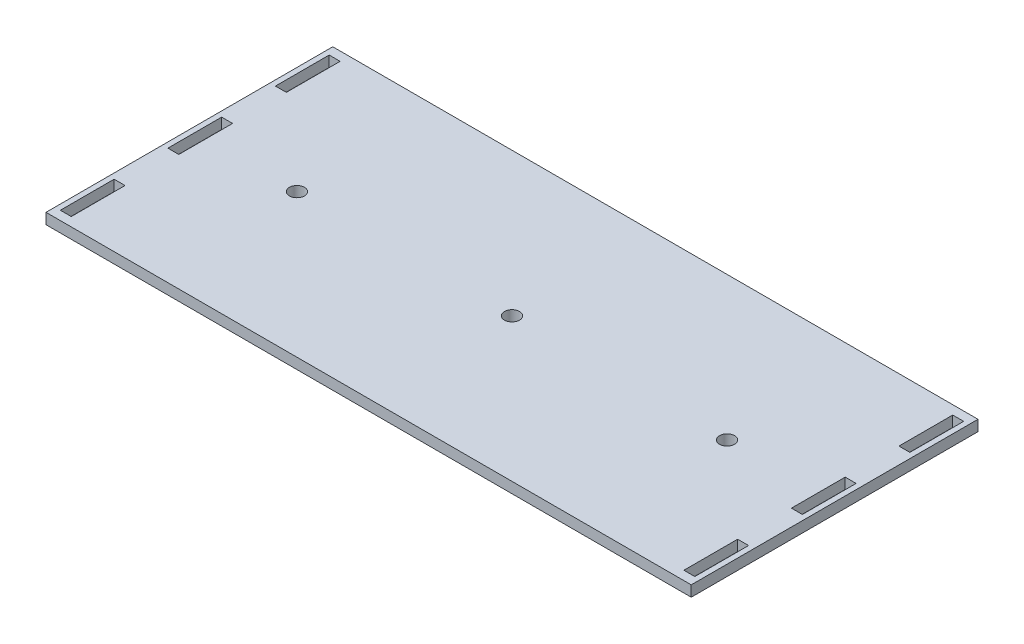
ISO-10303-21;
HEADER;
FILE_DESCRIPTION(('STEP AP214'),'2;1');
FILE_NAME('part.step','',(''),(''),'','','');
FILE_SCHEMA(('AUTOMOTIVE_DESIGN { 1 0 10303 214 1 1 1 1 }'));
ENDSEC;
DATA;
#1=APPLICATION_CONTEXT('core data for automotive mechanical design processes');
#2=APPLICATION_PROTOCOL_DEFINITION('international standard','automotive_design',2000,#1);
#3=PRODUCT_CONTEXT('',#1,'mechanical');
#4=PRODUCT('Part','Part','',(#3));
#5=PRODUCT_RELATED_PRODUCT_CATEGORY('part','',(#4));
#6=PRODUCT_DEFINITION_FORMATION('','',#4);
#7=PRODUCT_DEFINITION_CONTEXT('part definition',#1,'design');
#8=PRODUCT_DEFINITION('design','',#6,#7);
#9=PRODUCT_DEFINITION_SHAPE('','',#8);
#10=(LENGTH_UNIT() NAMED_UNIT(*) SI_UNIT(.MILLI.,.METRE.));
#11=(NAMED_UNIT(*) PLANE_ANGLE_UNIT() SI_UNIT($,.RADIAN.));
#12=(NAMED_UNIT(*) SI_UNIT($,.STERADIAN.) SOLID_ANGLE_UNIT());
#13=UNCERTAINTY_MEASURE_WITH_UNIT(LENGTH_MEASURE(1.E-05),#10,'distance_accuracy_value','');
#14=(GEOMETRIC_REPRESENTATION_CONTEXT(3) GLOBAL_UNCERTAINTY_ASSIGNED_CONTEXT((#13)) GLOBAL_UNIT_ASSIGNED_CONTEXT((#10,
#11,#12)) REPRESENTATION_CONTEXT('',''));
#15=CARTESIAN_POINT('',(0.,0.,0.));
#16=DIRECTION('',(0.,0.,1.));
#17=DIRECTION('',(1.,0.,0.));
#18=AXIS2_PLACEMENT_3D('',#15,#16,#17);
#19=CARTESIAN_POINT('',(2.55942807931008E-13,3.,-37.5000000000006));
#20=DIRECTION('',(0.,0.,1.));
#21=DIRECTION('',(1.,0.,0.));
#22=AXIS2_PLACEMENT_3D('',#19,#20,#21);
#23=PLANE('',#22);
#24=DIRECTION('',(-1.,0.,0.));
#25=VECTOR('',#24,1.);
#26=CARTESIAN_POINT('',(2.55942807931008E-13,0.,-37.5000000000006));
#27=LINE('',#26,#25);
#28=CARTESIAN_POINT('',(88.5,0.,-37.5));
#29=VERTEX_POINT('',#28);
#30=CARTESIAN_POINT('',(85.45,0.,-37.5));
#31=VERTEX_POINT('',#30);
#32=EDGE_CURVE('E455',#29,#31,#27,.T.);
#33=ORIENTED_EDGE('',*,*,#32,.F.);
#34=DIRECTION('',(0.,-1.,0.));
#35=VECTOR('',#34,1.);
#36=CARTESIAN_POINT('',(88.5,3.,-37.5));
#37=LINE('',#36,#35);
#38=CARTESIAN_POINT('',(88.5,3.,-37.5));
#39=VERTEX_POINT('',#38);
#40=EDGE_CURVE('E11',#39,#29,#37,.T.);
#41=ORIENTED_EDGE('',*,*,#40,.F.);
#42=DIRECTION('',(-1.,0.,0.));
#43=VECTOR('',#42,1.);
#44=CARTESIAN_POINT('',(2.55942807931008E-13,3.,-37.5000000000006));
#45=LINE('',#44,#43);
#46=CARTESIAN_POINT('',(85.45,3.,-37.5));
#47=VERTEX_POINT('',#46);
#48=EDGE_CURVE('E252',#39,#47,#45,.T.);
#49=ORIENTED_EDGE('',*,*,#48,.T.);
#50=DIRECTION('',(0.,-1.,0.));
#51=VECTOR('',#50,1.);
#52=CARTESIAN_POINT('',(85.45,3.,-37.5));
#53=LINE('',#52,#51);
#54=EDGE_CURVE('E65',#47,#31,#53,.T.);
#55=ORIENTED_EDGE('',*,*,#54,.T.);
#56=EDGE_LOOP('',(#33,#41,#49,#55));
#57=FACE_BOUND('',#56,.T.);
#58=ADVANCED_FACE('F45',(#57),#23,.T.);
#59=CARTESIAN_POINT('',(88.5,3.,0.));
#60=DIRECTION('',(1.,0.,0.));
#61=DIRECTION('',(0.,0.,-1.));
#62=AXIS2_PLACEMENT_3D('',#59,#60,#61);
#63=PLANE('',#62);
#64=DIRECTION('',(0.,0.,1.));
#65=VECTOR('',#64,1.);
#66=CARTESIAN_POINT('',(88.5,0.,0.));
#67=LINE('',#66,#65);
#68=CARTESIAN_POINT('',(88.5,0.,-22.5));
#69=VERTEX_POINT('',#68);
#70=EDGE_CURVE('E258',#29,#69,#67,.T.);
#71=ORIENTED_EDGE('',*,*,#70,.T.);
#72=DIRECTION('',(0.,-1.,0.));
#73=VECTOR('',#72,1.);
#74=CARTESIAN_POINT('',(88.5,3.,-22.5));
#75=LINE('',#74,#73);
#76=CARTESIAN_POINT('',(88.5,3.,-22.5));
#77=VERTEX_POINT('',#76);
#78=EDGE_CURVE('E56',#77,#69,#75,.T.);
#79=ORIENTED_EDGE('',*,*,#78,.F.);
#80=DIRECTION('',(0.,0.,1.));
#81=VECTOR('',#80,1.);
#82=CARTESIAN_POINT('',(88.5,3.,0.));
#83=LINE('',#82,#81);
#84=EDGE_CURVE('E247',#39,#77,#83,.T.);
#85=ORIENTED_EDGE('',*,*,#84,.F.);
#86=ORIENTED_EDGE('',*,*,#40,.T.);
#87=EDGE_LOOP('',(#71,#79,#85,#86));
#88=FACE_BOUND('',#87,.T.);
#89=ADVANCED_FACE('F256',(#88),#63,.F.);
#90=CARTESIAN_POINT('',(1.53565684758606E-13,3.,-22.5000000000006));
#91=DIRECTION('',(0.,0.,1.));
#92=DIRECTION('',(1.,0.,0.));
#93=AXIS2_PLACEMENT_3D('',#90,#91,#92);
#94=PLANE('',#93);
#95=DIRECTION('',(-1.,0.,0.));
#96=VECTOR('',#95,1.);
#97=CARTESIAN_POINT('',(1.53565684758606E-13,0.,-22.5000000000006));
#98=LINE('',#97,#96);
#99=CARTESIAN_POINT('',(85.45,0.,-22.5));
#100=VERTEX_POINT('',#99);
#101=EDGE_CURVE('E460',#69,#100,#98,.T.);
#102=ORIENTED_EDGE('',*,*,#101,.T.);
#103=DIRECTION('',(0.,-1.,0.));
#104=VECTOR('',#103,1.);
#105=CARTESIAN_POINT('',(85.45,3.,-22.5));
#106=LINE('',#105,#104);
#107=CARTESIAN_POINT('',(85.45,3.,-22.5));
#108=VERTEX_POINT('',#107);
#109=EDGE_CURVE('E151',#108,#100,#106,.T.);
#110=ORIENTED_EDGE('',*,*,#109,.F.);
#111=DIRECTION('',(-1.,0.,0.));
#112=VECTOR('',#111,1.);
#113=CARTESIAN_POINT('',(1.53565684758606E-13,3.,-22.5000000000006));
#114=LINE('',#113,#112);
#115=EDGE_CURVE('E238',#77,#108,#114,.T.);
#116=ORIENTED_EDGE('',*,*,#115,.F.);
#117=ORIENTED_EDGE('',*,*,#78,.T.);
#118=EDGE_LOOP('',(#102,#110,#116,#117));
#119=FACE_BOUND('',#118,.T.);
#120=ADVANCED_FACE('F240',(#119),#94,.F.);
#121=CARTESIAN_POINT('',(0.,3.,22.5));
#122=DIRECTION('',(0.,0.,-1.));
#123=DIRECTION('',(-1.,0.,0.));
#124=AXIS2_PLACEMENT_3D('',#121,#122,#123);
#125=PLANE('',#124);
#126=DIRECTION('',(1.,0.,0.));
#127=VECTOR('',#126,1.);
#128=CARTESIAN_POINT('',(0.,0.,22.5));
#129=LINE('',#128,#127);
#130=CARTESIAN_POINT('',(-88.4999999999999,0.,22.5));
#131=VERTEX_POINT('',#130);
#132=CARTESIAN_POINT('',(-85.4499999999999,0.,22.5));
#133=VERTEX_POINT('',#132);
#134=EDGE_CURVE('E439',#131,#133,#129,.T.);
#135=ORIENTED_EDGE('',*,*,#134,.T.);
#136=DIRECTION('',(0.,-1.,0.));
#137=VECTOR('',#136,1.);
#138=CARTESIAN_POINT('',(-85.4499999999999,3.,22.5));
#139=LINE('',#138,#137);
#140=CARTESIAN_POINT('',(-85.4499999999999,3.,22.5));
#141=VERTEX_POINT('',#140);
#142=EDGE_CURVE('E275',#141,#133,#139,.T.);
#143=ORIENTED_EDGE('',*,*,#142,.F.);
#144=DIRECTION('',(1.,0.,0.));
#145=VECTOR('',#144,1.);
#146=CARTESIAN_POINT('',(0.,3.,22.5));
#147=LINE('',#146,#145);
#148=CARTESIAN_POINT('',(-88.4999999999999,3.,22.5));
#149=VERTEX_POINT('',#148);
#150=EDGE_CURVE('E555',#149,#141,#147,.T.);
#151=ORIENTED_EDGE('',*,*,#150,.F.);
#152=DIRECTION('',(0.,-1.,0.));
#153=VECTOR('',#152,1.);
#154=CARTESIAN_POINT('',(-88.4999999999999,3.,22.5));
#155=LINE('',#154,#153);
#156=EDGE_CURVE('E265',#149,#131,#155,.T.);
#157=ORIENTED_EDGE('',*,*,#156,.T.);
#158=EDGE_LOOP('',(#135,#143,#151,#157));
#159=FACE_BOUND('',#158,.T.);
#160=ADVANCED_FACE('F617',(#159),#125,.F.);
#161=CARTESIAN_POINT('',(-85.4499999999999,3.,0.));
#162=DIRECTION('',(1.,0.,0.));
#163=DIRECTION('',(0.,0.,-1.));
#164=AXIS2_PLACEMENT_3D('',#161,#162,#163);
#165=PLANE('',#164);
#166=DIRECTION('',(0.,0.,1.));
#167=VECTOR('',#166,1.);
#168=CARTESIAN_POINT('',(-85.4499999999999,0.,0.));
#169=LINE('',#168,#167);
#170=CARTESIAN_POINT('',(-85.45,0.,37.5));
#171=VERTEX_POINT('',#170);
#172=EDGE_CURVE('E443',#133,#171,#169,.T.);
#173=ORIENTED_EDGE('',*,*,#172,.T.);
#174=DIRECTION('',(0.,-1.,0.));
#175=VECTOR('',#174,1.);
#176=CARTESIAN_POINT('',(-85.45,3.,37.5));
#177=LINE('',#176,#175);
#178=CARTESIAN_POINT('',(-85.45,3.,37.5));
#179=VERTEX_POINT('',#178);
#180=EDGE_CURVE('E272',#179,#171,#177,.T.);
#181=ORIENTED_EDGE('',*,*,#180,.F.);
#182=DIRECTION('',(0.,0.,1.));
#183=VECTOR('',#182,1.);
#184=CARTESIAN_POINT('',(-85.4499999999999,3.,0.));
#185=LINE('',#184,#183);
#186=EDGE_CURVE('E559',#141,#179,#185,.T.);
#187=ORIENTED_EDGE('',*,*,#186,.F.);
#188=ORIENTED_EDGE('',*,*,#142,.T.);
#189=EDGE_LOOP('',(#173,#181,#187,#188));
#190=FACE_BOUND('',#189,.T.);
#191=ADVANCED_FACE('F613',(#190),#165,.F.);
#192=CARTESIAN_POINT('',(0.,3.,37.5));
#193=DIRECTION('',(0.,0.,-1.));
#194=DIRECTION('',(-1.,0.,0.));
#195=AXIS2_PLACEMENT_3D('',#192,#193,#194);
#196=PLANE('',#195);
#197=DIRECTION('',(1.,0.,0.));
#198=VECTOR('',#197,1.);
#199=CARTESIAN_POINT('',(0.,0.,37.5));
#200=LINE('',#199,#198);
#201=CARTESIAN_POINT('',(-88.4999999999999,0.,37.5));
#202=VERTEX_POINT('',#201);
#203=EDGE_CURVE('E447',#202,#171,#200,.T.);
#204=ORIENTED_EDGE('',*,*,#203,.F.);
#205=DIRECTION('',(0.,-1.,0.));
#206=VECTOR('',#205,1.);
#207=CARTESIAN_POINT('',(-88.4999999999999,3.,37.5));
#208=LINE('',#207,#206);
#209=CARTESIAN_POINT('',(-88.4999999999999,3.,37.5));
#210=VERTEX_POINT('',#209);
#211=EDGE_CURVE('E268',#210,#202,#208,.T.);
#212=ORIENTED_EDGE('',*,*,#211,.F.);
#213=DIRECTION('',(1.,0.,0.));
#214=VECTOR('',#213,1.);
#215=CARTESIAN_POINT('',(0.,3.,37.5));
#216=LINE('',#215,#214);
#217=EDGE_CURVE('E562',#210,#179,#216,.T.);
#218=ORIENTED_EDGE('',*,*,#217,.T.);
#219=ORIENTED_EDGE('',*,*,#180,.T.);
#220=EDGE_LOOP('',(#204,#212,#218,#219));
#221=FACE_BOUND('',#220,.T.);
#222=ADVANCED_FACE('F609',(#221),#196,.T.);
#223=CARTESIAN_POINT('',(0.,3.,-7.50000000000006));
#224=DIRECTION('',(0.,0.,-1.));
#225=DIRECTION('',(-1.,0.,0.));
#226=AXIS2_PLACEMENT_3D('',#223,#224,#225);
#227=PLANE('',#226);
#228=DIRECTION('',(1.,0.,0.));
#229=VECTOR('',#228,1.);
#230=CARTESIAN_POINT('',(0.,0.,-7.50000000000006));
#231=LINE('',#230,#229);
#232=CARTESIAN_POINT('',(-88.5,0.,-7.50000000000001));
#233=VERTEX_POINT('',#232);
#234=CARTESIAN_POINT('',(-85.45,0.,-7.50000000000001));
#235=VERTEX_POINT('',#234);
#236=EDGE_CURVE('E423',#233,#235,#231,.T.);
#237=ORIENTED_EDGE('',*,*,#236,.T.);
#238=DIRECTION('',(0.,-1.,0.));
#239=VECTOR('',#238,1.);
#240=CARTESIAN_POINT('',(-85.45,3.,-7.50000000000001));
#241=LINE('',#240,#239);
#242=CARTESIAN_POINT('',(-85.45,3.,-7.50000000000001));
#243=VERTEX_POINT('',#242);
#244=EDGE_CURVE('E269',#243,#235,#241,.T.);
#245=ORIENTED_EDGE('',*,*,#244,.F.);
#246=DIRECTION('',(1.,0.,0.));
#247=VECTOR('',#246,1.);
#248=CARTESIAN_POINT('',(0.,3.,-7.50000000000006));
#249=LINE('',#248,#247);
#250=CARTESIAN_POINT('',(-88.5,3.,-7.50000000000001));
#251=VERTEX_POINT('',#250);
#252=EDGE_CURVE('E540',#251,#243,#249,.T.);
#253=ORIENTED_EDGE('',*,*,#252,.F.);
#254=DIRECTION('',(0.,-1.,0.));
#255=VECTOR('',#254,1.);
#256=CARTESIAN_POINT('',(-88.5,3.,-7.50000000000001));
#257=LINE('',#256,#255);
#258=EDGE_CURVE('E279',#251,#233,#257,.T.);
#259=ORIENTED_EDGE('',*,*,#258,.T.);
#260=EDGE_LOOP('',(#237,#245,#253,#259));
#261=FACE_BOUND('',#260,.T.);
#262=ADVANCED_FACE('F612',(#261),#227,.F.);
#263=CARTESIAN_POINT('',(-85.45,3.,0.));
#264=DIRECTION('',(1.,0.,0.));
#265=DIRECTION('',(0.,0.,-1.));
#266=AXIS2_PLACEMENT_3D('',#263,#264,#265);
#267=PLANE('',#266);
#268=DIRECTION('',(0.,0.,1.));
#269=VECTOR('',#268,1.);
#270=CARTESIAN_POINT('',(-85.45,0.,0.));
#271=LINE('',#270,#269);
#272=CARTESIAN_POINT('',(-85.45,0.,7.49999999999999));
#273=VERTEX_POINT('',#272);
#274=EDGE_CURVE('E427',#235,#273,#271,.T.);
#275=ORIENTED_EDGE('',*,*,#274,.T.);
#276=DIRECTION('',(0.,-1.,0.));
#277=VECTOR('',#276,1.);
#278=CARTESIAN_POINT('',(-85.45,3.,7.49999999999999));
#279=LINE('',#278,#277);
#280=CARTESIAN_POINT('',(-85.45,3.,7.49999999999999));
#281=VERTEX_POINT('',#280);
#282=EDGE_CURVE('E286',#281,#273,#279,.T.);
#283=ORIENTED_EDGE('',*,*,#282,.F.);
#284=DIRECTION('',(0.,0.,1.));
#285=VECTOR('',#284,1.);
#286=CARTESIAN_POINT('',(-85.45,3.,0.));
#287=LINE('',#286,#285);
#288=EDGE_CURVE('E544',#243,#281,#287,.T.);
#289=ORIENTED_EDGE('',*,*,#288,.F.);
#290=ORIENTED_EDGE('',*,*,#244,.T.);
#291=EDGE_LOOP('',(#275,#283,#289,#290));
#292=FACE_BOUND('',#291,.T.);
#293=ADVANCED_FACE('F630',(#292),#267,.F.);
#294=CARTESIAN_POINT('',(0.,3.,7.49999999999994));
#295=DIRECTION('',(0.,0.,-1.));
#296=DIRECTION('',(-1.,0.,0.));
#297=AXIS2_PLACEMENT_3D('',#294,#295,#296);
#298=PLANE('',#297);
#299=DIRECTION('',(1.,0.,0.));
#300=VECTOR('',#299,1.);
#301=CARTESIAN_POINT('',(0.,0.,7.49999999999994));
#302=LINE('',#301,#300);
#303=CARTESIAN_POINT('',(-88.5,0.,7.49999999999999));
#304=VERTEX_POINT('',#303);
#305=EDGE_CURVE('E431',#304,#273,#302,.T.);
#306=ORIENTED_EDGE('',*,*,#305,.F.);
#307=DIRECTION('',(0.,-1.,0.));
#308=VECTOR('',#307,1.);
#309=CARTESIAN_POINT('',(-88.5,3.,7.49999999999999));
#310=LINE('',#309,#308);
#311=CARTESIAN_POINT('',(-88.5,3.,7.49999999999999));
#312=VERTEX_POINT('',#311);
#313=EDGE_CURVE('E282',#312,#304,#310,.T.);
#314=ORIENTED_EDGE('',*,*,#313,.F.);
#315=DIRECTION('',(1.,0.,0.));
#316=VECTOR('',#315,1.);
#317=CARTESIAN_POINT('',(0.,3.,7.49999999999994));
#318=LINE('',#317,#316);
#319=EDGE_CURVE('E547',#312,#281,#318,.T.);
#320=ORIENTED_EDGE('',*,*,#319,.T.);
#321=ORIENTED_EDGE('',*,*,#282,.T.);
#322=EDGE_LOOP('',(#306,#314,#320,#321));
#323=FACE_BOUND('',#322,.T.);
#324=ADVANCED_FACE('F626',(#323),#298,.T.);
#325=CARTESIAN_POINT('',(0.,3.,-37.5));
#326=DIRECTION('',(0.,0.,-1.));
#327=DIRECTION('',(-1.,0.,0.));
#328=AXIS2_PLACEMENT_3D('',#325,#326,#327);
#329=PLANE('',#328);
#330=DIRECTION('',(1.,0.,0.));
#331=VECTOR('',#330,1.);
#332=CARTESIAN_POINT('',(0.,0.,-37.5));
#333=LINE('',#332,#331);
#334=CARTESIAN_POINT('',(-88.5,0.,-37.5));
#335=VERTEX_POINT('',#334);
#336=CARTESIAN_POINT('',(-85.45,0.,-37.5));
#337=VERTEX_POINT('',#336);
#338=EDGE_CURVE('E407',#335,#337,#333,.T.);
#339=ORIENTED_EDGE('',*,*,#338,.T.);
#340=DIRECTION('',(0.,-1.,0.));
#341=VECTOR('',#340,1.);
#342=CARTESIAN_POINT('',(-85.45,3.,-37.5));
#343=LINE('',#342,#341);
#344=CARTESIAN_POINT('',(-85.45,3.,-37.5));
#345=VERTEX_POINT('',#344);
#346=EDGE_CURVE('E283',#345,#337,#343,.T.);
#347=ORIENTED_EDGE('',*,*,#346,.F.);
#348=DIRECTION('',(1.,0.,0.));
#349=VECTOR('',#348,1.);
#350=CARTESIAN_POINT('',(0.,3.,-37.5));
#351=LINE('',#350,#349);
#352=CARTESIAN_POINT('',(-88.5,3.,-37.5));
#353=VERTEX_POINT('',#352);
#354=EDGE_CURVE('E525',#353,#345,#351,.T.);
#355=ORIENTED_EDGE('',*,*,#354,.F.);
#356=DIRECTION('',(0.,-1.,0.));
#357=VECTOR('',#356,1.);
#358=CARTESIAN_POINT('',(-88.5,3.,-37.5));
#359=LINE('',#358,#357);
#360=EDGE_CURVE('E292',#353,#335,#359,.T.);
#361=ORIENTED_EDGE('',*,*,#360,.T.);
#362=EDGE_LOOP('',(#339,#347,#355,#361));
#363=FACE_BOUND('',#362,.T.);
#364=ADVANCED_FACE('F629',(#363),#329,.F.);
#365=CARTESIAN_POINT('',(-85.4499999999999,3.,0.));
#366=DIRECTION('',(1.,0.,0.));
#367=DIRECTION('',(0.,0.,-1.));
#368=AXIS2_PLACEMENT_3D('',#365,#366,#367);
#369=PLANE('',#368);
#370=DIRECTION('',(0.,0.,1.));
#371=VECTOR('',#370,1.);
#372=CARTESIAN_POINT('',(-85.4499999999999,0.,0.));
#373=LINE('',#372,#371);
#374=CARTESIAN_POINT('',(-85.45,0.,-22.5));
#375=VERTEX_POINT('',#374);
#376=EDGE_CURVE('E411',#337,#375,#373,.T.);
#377=ORIENTED_EDGE('',*,*,#376,.T.);
#378=DIRECTION('',(0.,-1.,0.));
#379=VECTOR('',#378,1.);
#380=CARTESIAN_POINT('',(-85.45,3.,-22.5));
#381=LINE('',#380,#379);
#382=CARTESIAN_POINT('',(-85.45,3.,-22.5));
#383=VERTEX_POINT('',#382);
#384=EDGE_CURVE('E299',#383,#375,#381,.T.);
#385=ORIENTED_EDGE('',*,*,#384,.F.);
#386=DIRECTION('',(0.,0.,1.));
#387=VECTOR('',#386,1.);
#388=CARTESIAN_POINT('',(-85.4499999999999,3.,0.));
#389=LINE('',#388,#387);
#390=EDGE_CURVE('E529',#345,#383,#389,.T.);
#391=ORIENTED_EDGE('',*,*,#390,.F.);
#392=ORIENTED_EDGE('',*,*,#346,.T.);
#393=EDGE_LOOP('',(#377,#385,#391,#392));
#394=FACE_BOUND('',#393,.T.);
#395=ADVANCED_FACE('F646',(#394),#369,.F.);
#396=CARTESIAN_POINT('',(0.,3.,-22.5));
#397=DIRECTION('',(0.,0.,-1.));
#398=DIRECTION('',(-1.,0.,0.));
#399=AXIS2_PLACEMENT_3D('',#396,#397,#398);
#400=PLANE('',#399);
#401=DIRECTION('',(1.,0.,0.));
#402=VECTOR('',#401,1.);
#403=CARTESIAN_POINT('',(0.,0.,-22.5));
#404=LINE('',#403,#402);
#405=CARTESIAN_POINT('',(-88.5,0.,-22.5));
#406=VERTEX_POINT('',#405);
#407=EDGE_CURVE('E415',#406,#375,#404,.T.);
#408=ORIENTED_EDGE('',*,*,#407,.F.);
#409=DIRECTION('',(0.,-1.,0.));
#410=VECTOR('',#409,1.);
#411=CARTESIAN_POINT('',(-88.5,3.,-22.5));
#412=LINE('',#411,#410);
#413=CARTESIAN_POINT('',(-88.5,3.,-22.5));
#414=VERTEX_POINT('',#413);
#415=EDGE_CURVE('E295',#414,#406,#412,.T.);
#416=ORIENTED_EDGE('',*,*,#415,.F.);
#417=DIRECTION('',(1.,0.,0.));
#418=VECTOR('',#417,1.);
#419=CARTESIAN_POINT('',(0.,3.,-22.5));
#420=LINE('',#419,#418);
#421=EDGE_CURVE('E532',#414,#383,#420,.T.);
#422=ORIENTED_EDGE('',*,*,#421,.T.);
#423=ORIENTED_EDGE('',*,*,#384,.T.);
#424=EDGE_LOOP('',(#408,#416,#422,#423));
#425=FACE_BOUND('',#424,.T.);
#426=ADVANCED_FACE('F642',(#425),#400,.T.);
#427=CARTESIAN_POINT('',(0.,3.,40.));
#428=DIRECTION('',(0.,0.,-1.));
#429=DIRECTION('',(-1.,0.,0.));
#430=AXIS2_PLACEMENT_3D('',#427,#428,#429);
#431=PLANE('',#430);
#432=DIRECTION('',(1.,0.,0.));
#433=VECTOR('',#432,1.);
#434=CARTESIAN_POINT('',(0.,0.,40.));
#435=LINE('',#434,#433);
#436=CARTESIAN_POINT('',(-90.,0.,40.));
#437=VERTEX_POINT('',#436);
#438=CARTESIAN_POINT('',(90.,0.,40.));
#439=VERTEX_POINT('',#438);
#440=EDGE_CURVE('E391',#437,#439,#435,.T.);
#441=ORIENTED_EDGE('',*,*,#440,.T.);
#442=DIRECTION('',(0.,-1.,0.));
#443=VECTOR('',#442,1.);
#444=CARTESIAN_POINT('',(90.,3.,40.));
#445=LINE('',#444,#443);
#446=CARTESIAN_POINT('',(90.,3.,40.));
#447=VERTEX_POINT('',#446);
#448=EDGE_CURVE('E296',#447,#439,#445,.T.);
#449=ORIENTED_EDGE('',*,*,#448,.F.);
#450=DIRECTION('',(1.,0.,0.));
#451=VECTOR('',#450,1.);
#452=CARTESIAN_POINT('',(0.,3.,40.));
#453=LINE('',#452,#451);
#454=CARTESIAN_POINT('',(-90.,3.,40.));
#455=VERTEX_POINT('',#454);
#456=EDGE_CURVE('E510',#455,#447,#453,.T.);
#457=ORIENTED_EDGE('',*,*,#456,.F.);
#458=DIRECTION('',(0.,-1.,0.));
#459=VECTOR('',#458,1.);
#460=CARTESIAN_POINT('',(-90.,3.,40.));
#461=LINE('',#460,#459);
#462=EDGE_CURVE('E305',#455,#437,#461,.T.);
#463=ORIENTED_EDGE('',*,*,#462,.T.);
#464=EDGE_LOOP('',(#441,#449,#457,#463));
#465=FACE_BOUND('',#464,.T.);
#466=ADVANCED_FACE('F645',(#465),#431,.F.);
#467=CARTESIAN_POINT('',(90.,3.,0.));
#468=DIRECTION('',(-1.,0.,0.));
#469=DIRECTION('',(0.,0.,1.));
#470=AXIS2_PLACEMENT_3D('',#467,#468,#469);
#471=PLANE('',#470);
#472=DIRECTION('',(0.,0.,-1.));
#473=VECTOR('',#472,1.);
#474=CARTESIAN_POINT('',(90.,0.,0.));
#475=LINE('',#474,#473);
#476=CARTESIAN_POINT('',(90.,0.,-40.));
#477=VERTEX_POINT('',#476);
#478=EDGE_CURVE('E395',#439,#477,#475,.T.);
#479=ORIENTED_EDGE('',*,*,#478,.T.);
#480=DIRECTION('',(0.,-1.,0.));
#481=VECTOR('',#480,1.);
#482=CARTESIAN_POINT('',(90.,3.,-40.));
#483=LINE('',#482,#481);
#484=CARTESIAN_POINT('',(90.,3.,-40.));
#485=VERTEX_POINT('',#484);
#486=EDGE_CURVE('E312',#485,#477,#483,.T.);
#487=ORIENTED_EDGE('',*,*,#486,.F.);
#488=DIRECTION('',(0.,0.,-1.));
#489=VECTOR('',#488,1.);
#490=CARTESIAN_POINT('',(90.,3.,0.));
#491=LINE('',#490,#489);
#492=EDGE_CURVE('E514',#447,#485,#491,.T.);
#493=ORIENTED_EDGE('',*,*,#492,.F.);
#494=ORIENTED_EDGE('',*,*,#448,.T.);
#495=EDGE_LOOP('',(#479,#487,#493,#494));
#496=FACE_BOUND('',#495,.T.);
#497=ADVANCED_FACE('F662',(#496),#471,.F.);
#498=CARTESIAN_POINT('',(0.,3.,-40.));
#499=DIRECTION('',(0.,0.,-1.));
#500=DIRECTION('',(-1.,0.,0.));
#501=AXIS2_PLACEMENT_3D('',#498,#499,#500);
#502=PLANE('',#501);
#503=DIRECTION('',(1.,0.,0.));
#504=VECTOR('',#503,1.);
#505=CARTESIAN_POINT('',(0.,0.,-40.));
#506=LINE('',#505,#504);
#507=CARTESIAN_POINT('',(-90.,0.,-40.));
#508=VERTEX_POINT('',#507);
#509=EDGE_CURVE('E399',#508,#477,#506,.T.);
#510=ORIENTED_EDGE('',*,*,#509,.F.);
#511=DIRECTION('',(0.,-1.,0.));
#512=VECTOR('',#511,1.);
#513=CARTESIAN_POINT('',(-90.,3.,-40.));
#514=LINE('',#513,#512);
#515=CARTESIAN_POINT('',(-90.,3.,-40.));
#516=VERTEX_POINT('',#515);
#517=EDGE_CURVE('E308',#516,#508,#514,.T.);
#518=ORIENTED_EDGE('',*,*,#517,.F.);
#519=DIRECTION('',(1.,0.,0.));
#520=VECTOR('',#519,1.);
#521=CARTESIAN_POINT('',(0.,3.,-40.));
#522=LINE('',#521,#520);
#523=EDGE_CURVE('E517',#516,#485,#522,.T.);
#524=ORIENTED_EDGE('',*,*,#523,.T.);
#525=ORIENTED_EDGE('',*,*,#486,.T.);
#526=EDGE_LOOP('',(#510,#518,#524,#525));
#527=FACE_BOUND('',#526,.T.);
#528=ADVANCED_FACE('F658',(#527),#502,.T.);
#529=CARTESIAN_POINT('',(-1.53565684758601E-13,3.,22.4999999999994));
#530=DIRECTION('',(0.,0.,1.));
#531=DIRECTION('',(1.,0.,0.));
#532=AXIS2_PLACEMENT_3D('',#529,#530,#531);
#533=PLANE('',#532);
#534=DIRECTION('',(-1.,0.,0.));
#535=VECTOR('',#534,1.);
#536=CARTESIAN_POINT('',(-1.53565684758601E-13,0.,22.4999999999994));
#537=LINE('',#536,#535);
#538=CARTESIAN_POINT('',(88.4999999999999,0.,22.5));
#539=VERTEX_POINT('',#538);
#540=CARTESIAN_POINT('',(85.45,0.,22.5));
#541=VERTEX_POINT('',#540);
#542=EDGE_CURVE('E375',#539,#541,#537,.T.);
#543=ORIENTED_EDGE('',*,*,#542,.F.);
#544=DIRECTION('',(0.,-1.,0.));
#545=VECTOR('',#544,1.);
#546=CARTESIAN_POINT('',(88.4999999999999,3.,22.5));
#547=LINE('',#546,#545);
#548=CARTESIAN_POINT('',(88.4999999999999,3.,22.5));
#549=VERTEX_POINT('',#548);
#550=EDGE_CURVE('E309',#549,#539,#547,.T.);
#551=ORIENTED_EDGE('',*,*,#550,.F.);
#552=DIRECTION('',(-1.,0.,0.));
#553=VECTOR('',#552,1.);
#554=CARTESIAN_POINT('',(-1.53565684758601E-13,3.,22.4999999999994));
#555=LINE('',#554,#553);
#556=CARTESIAN_POINT('',(85.45,3.,22.5));
#557=VERTEX_POINT('',#556);
#558=EDGE_CURVE('E495',#549,#557,#555,.T.);
#559=ORIENTED_EDGE('',*,*,#558,.T.);
#560=DIRECTION('',(0.,-1.,0.));
#561=VECTOR('',#560,1.);
#562=CARTESIAN_POINT('',(85.45,3.,22.5));
#563=LINE('',#562,#561);
#564=EDGE_CURVE('E318',#557,#541,#563,.T.);
#565=ORIENTED_EDGE('',*,*,#564,.T.);
#566=EDGE_LOOP('',(#543,#551,#559,#565));
#567=FACE_BOUND('',#566,.T.);
#568=ADVANCED_FACE('F661',(#567),#533,.T.);
#569=CARTESIAN_POINT('',(88.4999999999999,3.,0.));
#570=DIRECTION('',(1.,0.,0.));
#571=DIRECTION('',(0.,0.,-1.));
#572=AXIS2_PLACEMENT_3D('',#569,#570,#571);
#573=PLANE('',#572);
#574=DIRECTION('',(0.,0.,1.));
#575=VECTOR('',#574,1.);
#576=CARTESIAN_POINT('',(88.4999999999999,0.,0.));
#577=LINE('',#576,#575);
#578=CARTESIAN_POINT('',(88.4999999999999,0.,37.5));
#579=VERTEX_POINT('',#578);
#580=EDGE_CURVE('E379',#539,#579,#577,.T.);
#581=ORIENTED_EDGE('',*,*,#580,.T.);
#582=DIRECTION('',(0.,-1.,0.));
#583=VECTOR('',#582,1.);
#584=CARTESIAN_POINT('',(88.4999999999999,3.,37.5));
#585=LINE('',#584,#583);
#586=CARTESIAN_POINT('',(88.4999999999999,3.,37.5));
#587=VERTEX_POINT('',#586);
#588=EDGE_CURVE('E324',#587,#579,#585,.T.);
#589=ORIENTED_EDGE('',*,*,#588,.F.);
#590=DIRECTION('',(0.,0.,1.));
#591=VECTOR('',#590,1.);
#592=CARTESIAN_POINT('',(88.4999999999999,3.,0.));
#593=LINE('',#592,#591);
#594=EDGE_CURVE('E499',#549,#587,#593,.T.);
#595=ORIENTED_EDGE('',*,*,#594,.F.);
#596=ORIENTED_EDGE('',*,*,#550,.T.);
#597=EDGE_LOOP('',(#581,#589,#595,#596));
#598=FACE_BOUND('',#597,.T.);
#599=ADVANCED_FACE('F676',(#598),#573,.F.);
#600=CARTESIAN_POINT('',(-2.55942807931006E-13,3.,37.4999999999994));
#601=DIRECTION('',(0.,0.,1.));
#602=DIRECTION('',(1.,0.,0.));
#603=AXIS2_PLACEMENT_3D('',#600,#601,#602);
#604=PLANE('',#603);
#605=DIRECTION('',(-1.,0.,0.));
#606=VECTOR('',#605,1.);
#607=CARTESIAN_POINT('',(-2.55942807931006E-13,0.,37.4999999999994));
#608=LINE('',#607,#606);
#609=CARTESIAN_POINT('',(85.45,0.,37.5));
#610=VERTEX_POINT('',#609);
#611=EDGE_CURVE('E383',#579,#610,#608,.T.);
#612=ORIENTED_EDGE('',*,*,#611,.T.);
#613=DIRECTION('',(0.,-1.,0.));
#614=VECTOR('',#613,1.);
#615=CARTESIAN_POINT('',(85.45,3.,37.5));
#616=LINE('',#615,#614);
#617=CARTESIAN_POINT('',(85.45,3.,37.5));
#618=VERTEX_POINT('',#617);
#619=EDGE_CURVE('E321',#618,#610,#616,.T.);
#620=ORIENTED_EDGE('',*,*,#619,.F.);
#621=DIRECTION('',(-1.,0.,0.));
#622=VECTOR('',#621,1.);
#623=CARTESIAN_POINT('',(-2.55942807931006E-13,3.,37.4999999999994));
#624=LINE('',#623,#622);
#625=EDGE_CURVE('E503',#587,#618,#624,.T.);
#626=ORIENTED_EDGE('',*,*,#625,.F.);
#627=ORIENTED_EDGE('',*,*,#588,.T.);
#628=EDGE_LOOP('',(#612,#620,#626,#627));
#629=FACE_BOUND('',#628,.T.);
#630=ADVANCED_FACE('F673',(#629),#604,.F.);
#631=CARTESIAN_POINT('',(0.,3.,-7.50000000000066));
#632=DIRECTION('',(0.,0.,1.));
#633=DIRECTION('',(1.,0.,0.));
#634=AXIS2_PLACEMENT_3D('',#631,#632,#633);
#635=PLANE('',#634);
#636=DIRECTION('',(-1.,0.,0.));
#637=VECTOR('',#636,1.);
#638=CARTESIAN_POINT('',(0.,0.,-7.50000000000066));
#639=LINE('',#638,#637);
#640=CARTESIAN_POINT('',(88.5,0.,-7.50000000000001));
#641=VERTEX_POINT('',#640);
#642=CARTESIAN_POINT('',(85.45,0.,-7.50000000000003));
#643=VERTEX_POINT('',#642);
#644=EDGE_CURVE('E355',#641,#643,#639,.T.);
#645=ORIENTED_EDGE('',*,*,#644,.F.);
#646=DIRECTION('',(0.,-1.,0.));
#647=VECTOR('',#646,1.);
#648=CARTESIAN_POINT('',(88.5,3.,-7.50000000000001));
#649=LINE('',#648,#647);
#650=CARTESIAN_POINT('',(88.5,3.,-7.50000000000001));
#651=VERTEX_POINT('',#650);
#652=EDGE_CURVE('E49',#651,#641,#649,.T.);
#653=ORIENTED_EDGE('',*,*,#652,.F.);
#654=DIRECTION('',(-1.,0.,0.));
#655=VECTOR('',#654,1.);
#656=CARTESIAN_POINT('',(0.,3.,-7.50000000000066));
#657=LINE('',#656,#655);
#658=CARTESIAN_POINT('',(85.45,3.,-7.50000000000003));
#659=VERTEX_POINT('',#658);
#660=EDGE_CURVE('E483',#651,#659,#657,.T.);
#661=ORIENTED_EDGE('',*,*,#660,.T.);
#662=DIRECTION('',(0.,-1.,0.));
#663=VECTOR('',#662,1.);
#664=CARTESIAN_POINT('',(85.45,3.,-7.50000000000003));
#665=LINE('',#664,#663);
#666=EDGE_CURVE('E330',#659,#643,#665,.T.);
#667=ORIENTED_EDGE('',*,*,#666,.T.);
#668=EDGE_LOOP('',(#645,#653,#661,#667));
#669=FACE_BOUND('',#668,.T.);
#670=ADVANCED_FACE('F360',(#669),#635,.T.);
#671=CARTESIAN_POINT('',(88.5,3.,0.));
#672=DIRECTION('',(1.,0.,0.));
#673=DIRECTION('',(0.,0.,-1.));
#674=AXIS2_PLACEMENT_3D('',#671,#672,#673);
#675=PLANE('',#674);
#676=DIRECTION('',(0.,0.,1.));
#677=VECTOR('',#676,1.);
#678=CARTESIAN_POINT('',(88.5,0.,0.));
#679=LINE('',#678,#677);
#680=CARTESIAN_POINT('',(88.5,0.,7.49999999999999));
#681=VERTEX_POINT('',#680);
#682=EDGE_CURVE('E346',#641,#681,#679,.T.);
#683=ORIENTED_EDGE('',*,*,#682,.T.);
#684=DIRECTION('',(0.,-1.,0.));
#685=VECTOR('',#684,1.);
#686=CARTESIAN_POINT('',(88.5,3.,7.49999999999999));
#687=LINE('',#686,#685);
#688=CARTESIAN_POINT('',(88.5,3.,7.49999999999999));
#689=VERTEX_POINT('',#688);
#690=EDGE_CURVE('E335',#689,#681,#687,.T.);
#691=ORIENTED_EDGE('',*,*,#690,.F.);
#692=DIRECTION('',(0.,0.,1.));
#693=VECTOR('',#692,1.);
#694=CARTESIAN_POINT('',(88.5,3.,0.));
#695=LINE('',#694,#693);
#696=EDGE_CURVE('E348',#651,#689,#695,.T.);
#697=ORIENTED_EDGE('',*,*,#696,.F.);
#698=ORIENTED_EDGE('',*,*,#652,.T.);
#699=EDGE_LOOP('',(#683,#691,#697,#698));
#700=FACE_BOUND('',#699,.T.);
#701=ADVANCED_FACE('F345',(#700),#675,.F.);
#702=CARTESIAN_POINT('',(0.,3.,7.49999999999934));
#703=DIRECTION('',(0.,0.,1.));
#704=DIRECTION('',(1.,0.,0.));
#705=AXIS2_PLACEMENT_3D('',#702,#703,#704);
#706=PLANE('',#705);
#707=DIRECTION('',(-1.,0.,0.));
#708=VECTOR('',#707,1.);
#709=CARTESIAN_POINT('',(0.,0.,7.49999999999934));
#710=LINE('',#709,#708);
#711=CARTESIAN_POINT('',(85.45,0.,7.49999999999997));
#712=VERTEX_POINT('',#711);
#713=EDGE_CURVE('E357',#681,#712,#710,.T.);
#714=ORIENTED_EDGE('',*,*,#713,.T.);
#715=DIRECTION('',(0.,-1.,0.));
#716=VECTOR('',#715,1.);
#717=CARTESIAN_POINT('',(85.45,3.,7.49999999999997));
#718=LINE('',#717,#716);
#719=CARTESIAN_POINT('',(85.45,3.,7.49999999999997));
#720=VERTEX_POINT('',#719);
#721=EDGE_CURVE('E333',#720,#712,#718,.T.);
#722=ORIENTED_EDGE('',*,*,#721,.F.);
#723=DIRECTION('',(-1.,0.,0.));
#724=VECTOR('',#723,1.);
#725=CARTESIAN_POINT('',(0.,3.,7.49999999999934));
#726=LINE('',#725,#724);
#727=EDGE_CURVE('E488',#689,#720,#726,.T.);
#728=ORIENTED_EDGE('',*,*,#727,.F.);
#729=ORIENTED_EDGE('',*,*,#690,.T.);
#730=EDGE_LOOP('',(#714,#722,#728,#729));
#731=FACE_BOUND('',#730,.T.);
#732=ADVANCED_FACE('F607',(#731),#706,.F.);
#733=CARTESIAN_POINT('',(-88.4999999999999,3.,0.));
#734=DIRECTION('',(1.,0.,0.));
#735=DIRECTION('',(0.,0.,-1.));
#736=AXIS2_PLACEMENT_3D('',#733,#734,#735);
#737=PLANE('',#736);
#738=DIRECTION('',(0.,0.,1.));
#739=VECTOR('',#738,1.);
#740=CARTESIAN_POINT('',(-88.4999999999999,0.,0.));
#741=LINE('',#740,#739);
#742=EDGE_CURVE('E451',#131,#202,#741,.T.);
#743=ORIENTED_EDGE('',*,*,#742,.F.);
#744=ORIENTED_EDGE('',*,*,#156,.F.);
#745=DIRECTION('',(0.,0.,1.));
#746=VECTOR('',#745,1.);
#747=CARTESIAN_POINT('',(-88.4999999999999,3.,0.));
#748=LINE('',#747,#746);
#749=EDGE_CURVE('E566',#149,#210,#748,.T.);
#750=ORIENTED_EDGE('',*,*,#749,.T.);
#751=ORIENTED_EDGE('',*,*,#211,.T.);
#752=EDGE_LOOP('',(#743,#744,#750,#751));
#753=FACE_BOUND('',#752,.T.);
#754=ADVANCED_FACE('F603',(#753),#737,.T.);
#755=CARTESIAN_POINT('',(-88.5,3.,0.));
#756=DIRECTION('',(1.,0.,0.));
#757=DIRECTION('',(0.,0.,-1.));
#758=AXIS2_PLACEMENT_3D('',#755,#756,#757);
#759=PLANE('',#758);
#760=DIRECTION('',(0.,0.,1.));
#761=VECTOR('',#760,1.);
#762=CARTESIAN_POINT('',(-88.5,0.,0.));
#763=LINE('',#762,#761);
#764=EDGE_CURVE('E435',#233,#304,#763,.T.);
#765=ORIENTED_EDGE('',*,*,#764,.F.);
#766=ORIENTED_EDGE('',*,*,#258,.F.);
#767=DIRECTION('',(0.,0.,1.));
#768=VECTOR('',#767,1.);
#769=CARTESIAN_POINT('',(-88.5,3.,0.));
#770=LINE('',#769,#768);
#771=EDGE_CURVE('E551',#251,#312,#770,.T.);
#772=ORIENTED_EDGE('',*,*,#771,.T.);
#773=ORIENTED_EDGE('',*,*,#313,.T.);
#774=EDGE_LOOP('',(#765,#766,#772,#773));
#775=FACE_BOUND('',#774,.T.);
#776=ADVANCED_FACE('F606',(#775),#759,.T.);
#777=CARTESIAN_POINT('',(-88.5,3.,0.));
#778=DIRECTION('',(1.,0.,0.));
#779=DIRECTION('',(0.,0.,-1.));
#780=AXIS2_PLACEMENT_3D('',#777,#778,#779);
#781=PLANE('',#780);
#782=DIRECTION('',(0.,0.,1.));
#783=VECTOR('',#782,1.);
#784=CARTESIAN_POINT('',(-88.5,0.,0.));
#785=LINE('',#784,#783);
#786=EDGE_CURVE('E419',#335,#406,#785,.T.);
#787=ORIENTED_EDGE('',*,*,#786,.F.);
#788=ORIENTED_EDGE('',*,*,#360,.F.);
#789=DIRECTION('',(0.,0.,1.));
#790=VECTOR('',#789,1.);
#791=CARTESIAN_POINT('',(-88.5,3.,0.));
#792=LINE('',#791,#790);
#793=EDGE_CURVE('E536',#353,#414,#792,.T.);
#794=ORIENTED_EDGE('',*,*,#793,.T.);
#795=ORIENTED_EDGE('',*,*,#415,.T.);
#796=EDGE_LOOP('',(#787,#788,#794,#795));
#797=FACE_BOUND('',#796,.T.);
#798=ADVANCED_FACE('F624',(#797),#781,.T.);
#799=CARTESIAN_POINT('',(-90.,3.,0.));
#800=DIRECTION('',(-1.,0.,0.));
#801=DIRECTION('',(0.,0.,1.));
#802=AXIS2_PLACEMENT_3D('',#799,#800,#801);
#803=PLANE('',#802);
#804=DIRECTION('',(0.,0.,-1.));
#805=VECTOR('',#804,1.);
#806=CARTESIAN_POINT('',(-90.,0.,0.));
#807=LINE('',#806,#805);
#808=EDGE_CURVE('E403',#437,#508,#807,.T.);
#809=ORIENTED_EDGE('',*,*,#808,.F.);
#810=ORIENTED_EDGE('',*,*,#462,.F.);
#811=DIRECTION('',(0.,0.,-1.));
#812=VECTOR('',#811,1.);
#813=CARTESIAN_POINT('',(-90.,3.,0.));
#814=LINE('',#813,#812);
#815=EDGE_CURVE('E521',#455,#516,#814,.T.);
#816=ORIENTED_EDGE('',*,*,#815,.T.);
#817=ORIENTED_EDGE('',*,*,#517,.T.);
#818=EDGE_LOOP('',(#809,#810,#816,#817));
#819=FACE_BOUND('',#818,.T.);
#820=ADVANCED_FACE('F640',(#819),#803,.T.);
#821=CARTESIAN_POINT('',(85.45,3.,0.));
#822=DIRECTION('',(1.,0.,0.));
#823=DIRECTION('',(0.,0.,-1.));
#824=AXIS2_PLACEMENT_3D('',#821,#822,#823);
#825=PLANE('',#824);
#826=DIRECTION('',(0.,0.,1.));
#827=VECTOR('',#826,1.);
#828=CARTESIAN_POINT('',(85.45,0.,0.));
#829=LINE('',#828,#827);
#830=EDGE_CURVE('E387',#541,#610,#829,.T.);
#831=ORIENTED_EDGE('',*,*,#830,.F.);
#832=ORIENTED_EDGE('',*,*,#564,.F.);
#833=DIRECTION('',(0.,0.,1.));
#834=VECTOR('',#833,1.);
#835=CARTESIAN_POINT('',(85.45,3.,0.));
#836=LINE('',#835,#834);
#837=EDGE_CURVE('E506',#557,#618,#836,.T.);
#838=ORIENTED_EDGE('',*,*,#837,.T.);
#839=ORIENTED_EDGE('',*,*,#619,.T.);
#840=EDGE_LOOP('',(#831,#832,#838,#839));
#841=FACE_BOUND('',#840,.T.);
#842=ADVANCED_FACE('F656',(#841),#825,.T.);
#843=CARTESIAN_POINT('',(85.45,3.,-1.58114262423699E-13));
#844=DIRECTION('',(1.,0.,0.));
#845=DIRECTION('',(0.,0.,-1.));
#846=AXIS2_PLACEMENT_3D('',#843,#844,#845);
#847=PLANE('',#846);
#848=DIRECTION('',(0.,0.,1.));
#849=VECTOR('',#848,1.);
#850=CARTESIAN_POINT('',(85.45,0.,-1.58114262423699E-13));
#851=LINE('',#850,#849);
#852=EDGE_CURVE('E372',#643,#712,#851,.T.);
#853=ORIENTED_EDGE('',*,*,#852,.F.);
#854=ORIENTED_EDGE('',*,*,#666,.F.);
#855=DIRECTION('',(0.,0.,1.));
#856=VECTOR('',#855,1.);
#857=CARTESIAN_POINT('',(85.45,3.,-1.58114262423699E-13));
#858=LINE('',#857,#856);
#859=EDGE_CURVE('E491',#659,#720,#858,.T.);
#860=ORIENTED_EDGE('',*,*,#859,.T.);
#861=ORIENTED_EDGE('',*,*,#721,.T.);
#862=EDGE_LOOP('',(#853,#854,#860,#861));
#863=FACE_BOUND('',#862,.T.);
#864=ADVANCED_FACE('F592',(#863),#847,.T.);
#865=CARTESIAN_POINT('',(-60.,3.,0.));
#866=DIRECTION('',(0.,-1.,0.));
#867=DIRECTION('',(0.,0.,-1.));
#868=AXIS2_PLACEMENT_3D('',#865,#866,#867);
#869=CYLINDRICAL_SURFACE('',#868,2.09999999999999);
#870=CARTESIAN_POINT('',(-60.,3.,0.));
#871=DIRECTION('',(0.,1.,0.));
#872=DIRECTION('',(0.,0.,1.));
#873=AXIS2_PLACEMENT_3D('',#870,#871,#872);
#874=CIRCLE('',#873,2.09999999999999);
#875=CARTESIAN_POINT('',(-60.,3.,2.09999999999999));
#876=VERTEX_POINT('',#875);
#877=EDGE_CURVE('E477',#876,#876,#874,.T.);
#878=ORIENTED_EDGE('',*,*,#877,.T.);
#879=EDGE_LOOP('',(#878));
#880=FACE_BOUND('',#879,.T.);
#881=CARTESIAN_POINT('',(-60.,0.,0.));
#882=DIRECTION('',(0.,1.,0.));
#883=DIRECTION('',(0.,0.,1.));
#884=AXIS2_PLACEMENT_3D('',#881,#882,#883);
#885=CIRCLE('',#884,2.09999999999999);
#886=CARTESIAN_POINT('',(-60.,0.,2.09999999999999));
#887=VERTEX_POINT('',#886);
#888=EDGE_CURVE('E362',#887,#887,#885,.T.);
#889=ORIENTED_EDGE('',*,*,#888,.F.);
#890=EDGE_LOOP('',(#889));
#891=FACE_BOUND('',#890,.T.);
#892=ADVANCED_FACE('F585',(#880,#891),#869,.F.);
#893=CARTESIAN_POINT('',(0.,3.,0.));
#894=DIRECTION('',(0.,-1.,0.));
#895=DIRECTION('',(0.,0.,-1.));
#896=AXIS2_PLACEMENT_3D('',#893,#894,#895);
#897=CYLINDRICAL_SURFACE('',#896,2.1);
#898=CARTESIAN_POINT('',(0.,3.,0.));
#899=DIRECTION('',(0.,1.,0.));
#900=DIRECTION('',(0.,0.,1.));
#901=AXIS2_PLACEMENT_3D('',#898,#899,#900);
#902=CIRCLE('',#901,2.1);
#903=CARTESIAN_POINT('',(0.,3.,2.09999999999999));
#904=VERTEX_POINT('',#903);
#905=EDGE_CURVE('E471',#904,#904,#902,.T.);
#906=ORIENTED_EDGE('',*,*,#905,.T.);
#907=EDGE_LOOP('',(#906));
#908=FACE_BOUND('',#907,.T.);
#909=CARTESIAN_POINT('',(0.,0.,0.));
#910=DIRECTION('',(0.,1.,0.));
#911=DIRECTION('',(0.,0.,1.));
#912=AXIS2_PLACEMENT_3D('',#909,#910,#911);
#913=CIRCLE('',#912,2.1);
#914=CARTESIAN_POINT('',(0.,0.,2.09999999999999));
#915=VERTEX_POINT('',#914);
#916=EDGE_CURVE('E366',#915,#915,#913,.T.);
#917=ORIENTED_EDGE('',*,*,#916,.F.);
#918=EDGE_LOOP('',(#917));
#919=FACE_BOUND('',#918,.T.);
#920=ADVANCED_FACE('F583',(#908,#919),#897,.F.);
#921=CARTESIAN_POINT('',(60.,3.,0.));
#922=DIRECTION('',(0.,-1.,0.));
#923=DIRECTION('',(0.,0.,-1.));
#924=AXIS2_PLACEMENT_3D('',#921,#922,#923);
#925=CYLINDRICAL_SURFACE('',#924,2.09999999999999);
#926=CARTESIAN_POINT('',(60.,3.,0.));
#927=DIRECTION('',(0.,1.,0.));
#928=DIRECTION('',(0.,0.,1.));
#929=AXIS2_PLACEMENT_3D('',#926,#927,#928);
#930=CIRCLE('',#929,2.09999999999999);
#931=CARTESIAN_POINT('',(60.,3.,2.09999999999998));
#932=VERTEX_POINT('',#931);
#933=EDGE_CURVE('E466',#932,#932,#930,.T.);
#934=ORIENTED_EDGE('',*,*,#933,.T.);
#935=EDGE_LOOP('',(#934));
#936=FACE_BOUND('',#935,.T.);
#937=CARTESIAN_POINT('',(60.,0.,0.));
#938=DIRECTION('',(0.,1.,0.));
#939=DIRECTION('',(0.,0.,1.));
#940=AXIS2_PLACEMENT_3D('',#937,#938,#939);
#941=CIRCLE('',#940,2.09999999999999);
#942=CARTESIAN_POINT('',(60.,0.,2.09999999999998));
#943=VERTEX_POINT('',#942);
#944=EDGE_CURVE('E574',#943,#943,#941,.T.);
#945=ORIENTED_EDGE('',*,*,#944,.F.);
#946=EDGE_LOOP('',(#945));
#947=FACE_BOUND('',#946,.T.);
#948=ADVANCED_FACE('F47',(#936,#947),#925,.F.);
#949=CARTESIAN_POINT('',(85.4499999999999,3.,0.));
#950=DIRECTION('',(1.,0.,0.));
#951=DIRECTION('',(0.,0.,-1.));
#952=AXIS2_PLACEMENT_3D('',#949,#950,#951);
#953=PLANE('',#952);
#954=DIRECTION('',(0.,0.,1.));
#955=VECTOR('',#954,1.);
#956=CARTESIAN_POINT('',(85.4499999999999,0.,0.));
#957=LINE('',#956,#955);
#958=EDGE_CURVE('E463',#31,#100,#957,.T.);
#959=ORIENTED_EDGE('',*,*,#958,.F.);
#960=ORIENTED_EDGE('',*,*,#54,.F.);
#961=DIRECTION('',(0.,0.,1.));
#962=VECTOR('',#961,1.);
#963=CARTESIAN_POINT('',(85.4499999999999,3.,0.));
#964=LINE('',#963,#962);
#965=EDGE_CURVE('E246',#47,#108,#964,.T.);
#966=ORIENTED_EDGE('',*,*,#965,.T.);
#967=ORIENTED_EDGE('',*,*,#109,.T.);
#968=EDGE_LOOP('',(#959,#960,#966,#967));
#969=FACE_BOUND('',#968,.T.);
#970=ADVANCED_FACE('F591',(#969),#953,.T.);
#971=CARTESIAN_POINT('',(0.,3.,0.));
#972=DIRECTION('',(0.,1.,0.));
#973=DIRECTION('',(0.,0.,1.));
#974=AXIS2_PLACEMENT_3D('',#971,#972,#973);
#975=PLANE('',#974);
#976=ORIENTED_EDGE('',*,*,#933,.F.);
#977=EDGE_LOOP('',(#976));
#978=FACE_BOUND('',#977,.T.);
#979=ORIENTED_EDGE('',*,*,#905,.F.);
#980=EDGE_LOOP('',(#979));
#981=FACE_BOUND('',#980,.T.);
#982=ORIENTED_EDGE('',*,*,#877,.F.);
#983=EDGE_LOOP('',(#982));
#984=FACE_BOUND('',#983,.T.);
#985=ORIENTED_EDGE('',*,*,#660,.F.);
#986=ORIENTED_EDGE('',*,*,#696,.T.);
#987=ORIENTED_EDGE('',*,*,#727,.T.);
#988=ORIENTED_EDGE('',*,*,#859,.F.);
#989=EDGE_LOOP('',(#985,#986,#987,#988));
#990=FACE_BOUND('',#989,.T.);
#991=ORIENTED_EDGE('',*,*,#558,.F.);
#992=ORIENTED_EDGE('',*,*,#594,.T.);
#993=ORIENTED_EDGE('',*,*,#625,.T.);
#994=ORIENTED_EDGE('',*,*,#837,.F.);
#995=EDGE_LOOP('',(#991,#992,#993,#994));
#996=FACE_BOUND('',#995,.T.);
#997=ORIENTED_EDGE('',*,*,#456,.T.);
#998=ORIENTED_EDGE('',*,*,#492,.T.);
#999=ORIENTED_EDGE('',*,*,#523,.F.);
#1000=ORIENTED_EDGE('',*,*,#815,.F.);
#1001=EDGE_LOOP('',(#997,#998,#999,#1000));
#1002=FACE_BOUND('',#1001,.T.);
#1003=ORIENTED_EDGE('',*,*,#354,.T.);
#1004=ORIENTED_EDGE('',*,*,#390,.T.);
#1005=ORIENTED_EDGE('',*,*,#421,.F.);
#1006=ORIENTED_EDGE('',*,*,#793,.F.);
#1007=EDGE_LOOP('',(#1003,#1004,#1005,#1006));
#1008=FACE_BOUND('',#1007,.T.);
#1009=ORIENTED_EDGE('',*,*,#252,.T.);
#1010=ORIENTED_EDGE('',*,*,#288,.T.);
#1011=ORIENTED_EDGE('',*,*,#319,.F.);
#1012=ORIENTED_EDGE('',*,*,#771,.F.);
#1013=EDGE_LOOP('',(#1009,#1010,#1011,#1012));
#1014=FACE_BOUND('',#1013,.T.);
#1015=ORIENTED_EDGE('',*,*,#150,.T.);
#1016=ORIENTED_EDGE('',*,*,#186,.T.);
#1017=ORIENTED_EDGE('',*,*,#217,.F.);
#1018=ORIENTED_EDGE('',*,*,#749,.F.);
#1019=EDGE_LOOP('',(#1015,#1016,#1017,#1018));
#1020=FACE_BOUND('',#1019,.T.);
#1021=ORIENTED_EDGE('',*,*,#48,.F.);
#1022=ORIENTED_EDGE('',*,*,#84,.T.);
#1023=ORIENTED_EDGE('',*,*,#115,.T.);
#1024=ORIENTED_EDGE('',*,*,#965,.F.);
#1025=EDGE_LOOP('',(#1021,#1022,#1023,#1024));
#1026=FACE_BOUND('',#1025,.T.);
#1027=ADVANCED_FACE('F251',(#978,#981,#984,#990,#996,#1002,#1008,#1014,#1020,#1026),#975,.T.);
#1028=CARTESIAN_POINT('',(0.,0.,0.));
#1029=DIRECTION('',(0.,1.,0.));
#1030=DIRECTION('',(0.,0.,1.));
#1031=AXIS2_PLACEMENT_3D('',#1028,#1029,#1030);
#1032=PLANE('',#1031);
#1033=ORIENTED_EDGE('',*,*,#944,.T.);
#1034=EDGE_LOOP('',(#1033));
#1035=FACE_BOUND('',#1034,.T.);
#1036=ORIENTED_EDGE('',*,*,#916,.T.);
#1037=EDGE_LOOP('',(#1036));
#1038=FACE_BOUND('',#1037,.T.);
#1039=ORIENTED_EDGE('',*,*,#888,.T.);
#1040=EDGE_LOOP('',(#1039));
#1041=FACE_BOUND('',#1040,.T.);
#1042=ORIENTED_EDGE('',*,*,#644,.T.);
#1043=ORIENTED_EDGE('',*,*,#852,.T.);
#1044=ORIENTED_EDGE('',*,*,#713,.F.);
#1045=ORIENTED_EDGE('',*,*,#682,.F.);
#1046=EDGE_LOOP('',(#1042,#1043,#1044,#1045));
#1047=FACE_BOUND('',#1046,.T.);
#1048=ORIENTED_EDGE('',*,*,#542,.T.);
#1049=ORIENTED_EDGE('',*,*,#830,.T.);
#1050=ORIENTED_EDGE('',*,*,#611,.F.);
#1051=ORIENTED_EDGE('',*,*,#580,.F.);
#1052=EDGE_LOOP('',(#1048,#1049,#1050,#1051));
#1053=FACE_BOUND('',#1052,.T.);
#1054=ORIENTED_EDGE('',*,*,#440,.F.);
#1055=ORIENTED_EDGE('',*,*,#808,.T.);
#1056=ORIENTED_EDGE('',*,*,#509,.T.);
#1057=ORIENTED_EDGE('',*,*,#478,.F.);
#1058=EDGE_LOOP('',(#1054,#1055,#1056,#1057));
#1059=FACE_BOUND('',#1058,.T.);
#1060=ORIENTED_EDGE('',*,*,#338,.F.);
#1061=ORIENTED_EDGE('',*,*,#786,.T.);
#1062=ORIENTED_EDGE('',*,*,#407,.T.);
#1063=ORIENTED_EDGE('',*,*,#376,.F.);
#1064=EDGE_LOOP('',(#1060,#1061,#1062,#1063));
#1065=FACE_BOUND('',#1064,.T.);
#1066=ORIENTED_EDGE('',*,*,#236,.F.);
#1067=ORIENTED_EDGE('',*,*,#764,.T.);
#1068=ORIENTED_EDGE('',*,*,#305,.T.);
#1069=ORIENTED_EDGE('',*,*,#274,.F.);
#1070=EDGE_LOOP('',(#1066,#1067,#1068,#1069));
#1071=FACE_BOUND('',#1070,.T.);
#1072=ORIENTED_EDGE('',*,*,#134,.F.);
#1073=ORIENTED_EDGE('',*,*,#742,.T.);
#1074=ORIENTED_EDGE('',*,*,#203,.T.);
#1075=ORIENTED_EDGE('',*,*,#172,.F.);
#1076=EDGE_LOOP('',(#1072,#1073,#1074,#1075));
#1077=FACE_BOUND('',#1076,.T.);
#1078=ORIENTED_EDGE('',*,*,#32,.T.);
#1079=ORIENTED_EDGE('',*,*,#958,.T.);
#1080=ORIENTED_EDGE('',*,*,#101,.F.);
#1081=ORIENTED_EDGE('',*,*,#70,.F.);
#1082=EDGE_LOOP('',(#1078,#1079,#1080,#1081));
#1083=FACE_BOUND('',#1082,.T.);
#1084=ADVANCED_FACE('F352',(#1035,#1038,#1041,#1047,#1053,#1059,#1065,#1071,#1077,#1083),#1032,.F.);
#1085=CLOSED_SHELL('',(#58,#89,#120,#160,#191,#222,#262,#293,#324,#364,#395,#426,#466,#497,#528,
#568,#599,#630,#670,#701,#732,#754,#776,#798,#820,#842,#864,#892,#920,#948,#970,#1027,#1084));
#1086=MANIFOLD_SOLID_BREP('B2',#1085);
#1087=ADVANCED_BREP_SHAPE_REPRESENTATION('',(#18,#1086),#14);
#1088=SHAPE_DEFINITION_REPRESENTATION(#9,#1087);
ENDSEC;
END-ISO-10303-21;
